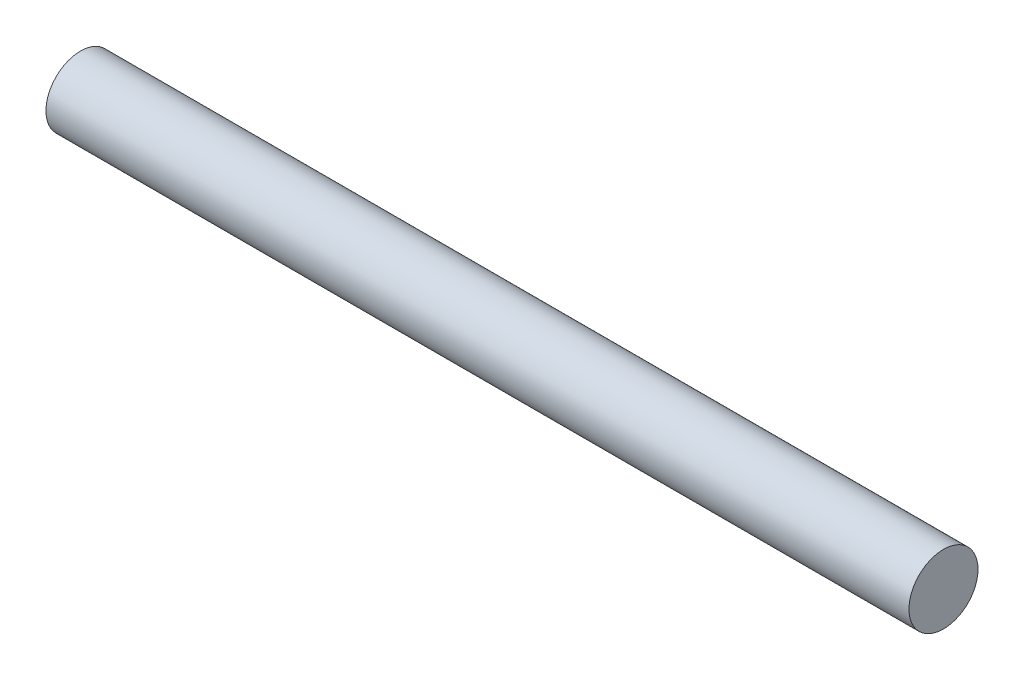
ISO-10303-21;
HEADER;
FILE_DESCRIPTION(('STEP AP214'),'2;1');
FILE_NAME('part.step','',(''),(''),'','','');
FILE_SCHEMA(('AUTOMOTIVE_DESIGN { 1 0 10303 214 1 1 1 1 }'));
ENDSEC;
DATA;
#1=APPLICATION_CONTEXT('core data for automotive mechanical design processes');
#2=APPLICATION_PROTOCOL_DEFINITION('international standard','automotive_design',2000,#1);
#3=PRODUCT_CONTEXT('',#1,'mechanical');
#4=PRODUCT('Part','Part','',(#3));
#5=PRODUCT_RELATED_PRODUCT_CATEGORY('part','',(#4));
#6=PRODUCT_DEFINITION_FORMATION('','',#4);
#7=PRODUCT_DEFINITION_CONTEXT('part definition',#1,'design');
#8=PRODUCT_DEFINITION('design','',#6,#7);
#9=PRODUCT_DEFINITION_SHAPE('','',#8);
#10=(LENGTH_UNIT() NAMED_UNIT(*) SI_UNIT(.MILLI.,.METRE.));
#11=(NAMED_UNIT(*) PLANE_ANGLE_UNIT() SI_UNIT($,.RADIAN.));
#12=(NAMED_UNIT(*) SI_UNIT($,.STERADIAN.) SOLID_ANGLE_UNIT());
#13=UNCERTAINTY_MEASURE_WITH_UNIT(LENGTH_MEASURE(1.E-05),#10,'distance_accuracy_value','');
#14=(GEOMETRIC_REPRESENTATION_CONTEXT(3) GLOBAL_UNCERTAINTY_ASSIGNED_CONTEXT((#13)) GLOBAL_UNIT_ASSIGNED_CONTEXT((#10,
#11,#12)) REPRESENTATION_CONTEXT('',''));
#15=CARTESIAN_POINT('',(0.,0.,0.));
#16=DIRECTION('',(0.,0.,1.));
#17=DIRECTION('',(1.,0.,0.));
#18=AXIS2_PLACEMENT_3D('',#15,#16,#17);
#19=CARTESIAN_POINT('',(100.,0.,0.));
#20=DIRECTION('',(-1.,0.,0.));
#21=DIRECTION('',(0.,0.,1.));
#22=AXIS2_PLACEMENT_3D('',#19,#20,#21);
#23=CYLINDRICAL_SURFACE('',#22,4.);
#24=CARTESIAN_POINT('',(100.,0.,0.));
#25=DIRECTION('',(1.,0.,0.));
#26=DIRECTION('',(0.,0.,-1.));
#27=AXIS2_PLACEMENT_3D('',#24,#25,#26);
#28=CIRCLE('',#27,4.);
#29=CARTESIAN_POINT('',(100.,0.,-4.));
#30=VERTEX_POINT('',#29);
#31=EDGE_CURVE('E10',#30,#30,#28,.T.);
#32=ORIENTED_EDGE('',*,*,#31,.F.);
#33=EDGE_LOOP('',(#32));
#34=FACE_BOUND('',#33,.T.);
#35=CARTESIAN_POINT('',(0.,0.,0.));
#36=DIRECTION('',(1.,0.,0.));
#37=DIRECTION('',(0.,0.,-1.));
#38=AXIS2_PLACEMENT_3D('',#35,#36,#37);
#39=CIRCLE('',#38,4.);
#40=CARTESIAN_POINT('',(0.,0.,-4.));
#41=VERTEX_POINT('',#40);
#42=EDGE_CURVE('E33',#41,#41,#39,.T.);
#43=ORIENTED_EDGE('',*,*,#42,.T.);
#44=EDGE_LOOP('',(#43));
#45=FACE_BOUND('',#44,.T.);
#46=ADVANCED_FACE('F30',(#34,#45),#23,.T.);
#47=CARTESIAN_POINT('',(100.,0.,0.));
#48=DIRECTION('',(1.,0.,0.));
#49=DIRECTION('',(0.,0.,-1.));
#50=AXIS2_PLACEMENT_3D('',#47,#48,#49);
#51=PLANE('',#50);
#52=ORIENTED_EDGE('',*,*,#31,.T.);
#53=EDGE_LOOP('',(#52));
#54=FACE_BOUND('',#53,.T.);
#55=ADVANCED_FACE('F45',(#54),#51,.T.);
#56=CARTESIAN_POINT('',(0.,0.,0.));
#57=DIRECTION('',(1.,0.,0.));
#58=DIRECTION('',(0.,0.,-1.));
#59=AXIS2_PLACEMENT_3D('',#56,#57,#58);
#60=PLANE('',#59);
#61=ORIENTED_EDGE('',*,*,#42,.F.);
#62=EDGE_LOOP('',(#61));
#63=FACE_BOUND('',#62,.T.);
#64=ADVANCED_FACE('F43',(#63),#60,.F.);
#65=CLOSED_SHELL('',(#46,#55,#64));
#66=MANIFOLD_SOLID_BREP('B2',#65);
#67=ADVANCED_BREP_SHAPE_REPRESENTATION('',(#18,#66),#14);
#68=SHAPE_DEFINITION_REPRESENTATION(#9,#67);
ENDSEC;
END-ISO-10303-21;
